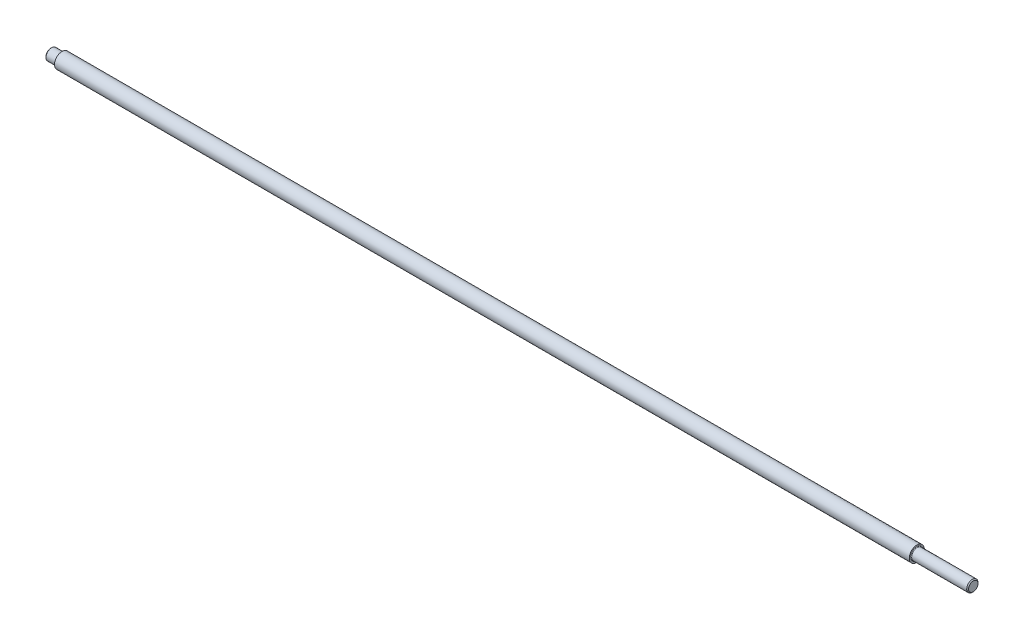
ISO-10303-21;
HEADER;
FILE_DESCRIPTION(('STEP AP214'),'2;1');
FILE_NAME('part.step','',(''),(''),'','','');
FILE_SCHEMA(('AUTOMOTIVE_DESIGN { 1 0 10303 214 1 1 1 1 }'));
ENDSEC;
DATA;
#1=APPLICATION_CONTEXT('core data for automotive mechanical design processes');
#2=APPLICATION_PROTOCOL_DEFINITION('international standard','automotive_design',2000,#1);
#3=PRODUCT_CONTEXT('',#1,'mechanical');
#4=PRODUCT('Part','Part','',(#3));
#5=PRODUCT_RELATED_PRODUCT_CATEGORY('part','',(#4));
#6=PRODUCT_DEFINITION_FORMATION('','',#4);
#7=PRODUCT_DEFINITION_CONTEXT('part definition',#1,'design');
#8=PRODUCT_DEFINITION('design','',#6,#7);
#9=PRODUCT_DEFINITION_SHAPE('','',#8);
#10=(LENGTH_UNIT() NAMED_UNIT(*) SI_UNIT(.MILLI.,.METRE.));
#11=(NAMED_UNIT(*) PLANE_ANGLE_UNIT() SI_UNIT($,.RADIAN.));
#12=(NAMED_UNIT(*) SI_UNIT($,.STERADIAN.) SOLID_ANGLE_UNIT());
#13=UNCERTAINTY_MEASURE_WITH_UNIT(LENGTH_MEASURE(1.E-05),#10,'distance_accuracy_value','');
#14=(GEOMETRIC_REPRESENTATION_CONTEXT(3) GLOBAL_UNCERTAINTY_ASSIGNED_CONTEXT((#13)) GLOBAL_UNIT_ASSIGNED_CONTEXT((#10,
#11,#12)) REPRESENTATION_CONTEXT('',''));
#15=CARTESIAN_POINT('',(0.,0.,0.));
#16=DIRECTION('',(0.,0.,1.));
#17=DIRECTION('',(1.,0.,0.));
#18=AXIS2_PLACEMENT_3D('',#15,#16,#17);
#19=CARTESIAN_POINT('',(0.5,0.,0.));
#20=DIRECTION('',(1.,0.,0.));
#21=DIRECTION('',(0.,0.,-1.));
#22=AXIS2_PLACEMENT_3D('',#19,#20,#21);
#23=CONICAL_SURFACE('',#22,3.,0.785398163397448);
#24=CARTESIAN_POINT('',(0.,0.,0.));
#25=DIRECTION('',(1.,0.,0.));
#26=DIRECTION('',(0.,0.,-1.));
#27=AXIS2_PLACEMENT_3D('',#24,#25,#26);
#28=CIRCLE('',#27,2.5);
#29=CARTESIAN_POINT('',(0.,0.,-2.5));
#30=VERTEX_POINT('',#29);
#31=EDGE_CURVE('E80',#30,#30,#28,.T.);
#32=ORIENTED_EDGE('',*,*,#31,.T.);
#33=EDGE_LOOP('',(#32));
#34=FACE_BOUND('',#33,.T.);
#35=CARTESIAN_POINT('',(0.5,0.,0.));
#36=DIRECTION('',(1.,0.,0.));
#37=DIRECTION('',(0.,0.,-1.));
#38=AXIS2_PLACEMENT_3D('',#35,#36,#37);
#39=CIRCLE('',#38,3.);
#40=CARTESIAN_POINT('',(0.5,0.,-3.));
#41=VERTEX_POINT('',#40);
#42=EDGE_CURVE('E12',#41,#41,#39,.T.);
#43=ORIENTED_EDGE('',*,*,#42,.F.);
#44=EDGE_LOOP('',(#43));
#45=FACE_BOUND('',#44,.T.);
#46=ADVANCED_FACE('F46',(#34,#45),#23,.T.);
#47=CARTESIAN_POINT('',(0.,0.,0.));
#48=DIRECTION('',(1.,0.,0.));
#49=DIRECTION('',(0.,0.,-1.));
#50=AXIS2_PLACEMENT_3D('',#47,#48,#49);
#51=CYLINDRICAL_SURFACE('',#50,3.);
#52=ORIENTED_EDGE('',*,*,#42,.T.);
#53=EDGE_LOOP('',(#52));
#54=FACE_BOUND('',#53,.T.);
#55=CARTESIAN_POINT('',(5.7,0.,0.));
#56=DIRECTION('',(1.,0.,0.));
#57=DIRECTION('',(0.,0.,-1.));
#58=AXIS2_PLACEMENT_3D('',#55,#56,#57);
#59=CIRCLE('',#58,3.);
#60=CARTESIAN_POINT('',(5.7,0.,-3.));
#61=VERTEX_POINT('',#60);
#62=EDGE_CURVE('E52',#61,#61,#59,.T.);
#63=ORIENTED_EDGE('',*,*,#62,.F.);
#64=EDGE_LOOP('',(#63));
#65=FACE_BOUND('',#64,.T.);
#66=ADVANCED_FACE('F97',(#54,#65),#51,.T.);
#67=CARTESIAN_POINT('',(5.70000000000012,0.,0.));
#68=DIRECTION('',(1.,0.,0.));
#69=DIRECTION('',(0.,0.,-1.));
#70=AXIS2_PLACEMENT_3D('',#67,#68,#69);
#71=TOROIDAL_SURFACE('',#70,3.29999999999988,0.299999999999877);
#72=ORIENTED_EDGE('',*,*,#62,.T.);
#73=EDGE_LOOP('',(#72));
#74=FACE_BOUND('',#73,.T.);
#75=CARTESIAN_POINT('',(6.,0.,0.));
#76=DIRECTION('',(1.,0.,0.));
#77=DIRECTION('',(0.,0.,-1.));
#78=AXIS2_PLACEMENT_3D('',#75,#76,#77);
#79=CIRCLE('',#78,3.29999999999988);
#80=CARTESIAN_POINT('',(6.,0.,-3.29999999999988));
#81=VERTEX_POINT('',#80);
#82=EDGE_CURVE('E56',#81,#81,#79,.T.);
#83=ORIENTED_EDGE('',*,*,#82,.F.);
#84=EDGE_LOOP('',(#83));
#85=FACE_BOUND('',#84,.T.);
#86=ADVANCED_FACE('F101',(#74,#85),#71,.F.);
#87=CARTESIAN_POINT('',(6.,4.,0.));
#88=DIRECTION('',(-1.,0.,0.));
#89=DIRECTION('',(0.,0.,1.));
#90=AXIS2_PLACEMENT_3D('',#87,#88,#89);
#91=PLANE('',#90);
#92=ORIENTED_EDGE('',*,*,#82,.T.);
#93=EDGE_LOOP('',(#92));
#94=FACE_BOUND('',#93,.T.);
#95=CARTESIAN_POINT('',(6.,0.,0.));
#96=DIRECTION('',(1.,0.,0.));
#97=DIRECTION('',(0.,0.,-1.));
#98=AXIS2_PLACEMENT_3D('',#95,#96,#97);
#99=CIRCLE('',#98,4.);
#100=CARTESIAN_POINT('',(6.,0.,-4.));
#101=VERTEX_POINT('',#100);
#102=EDGE_CURVE('E60',#101,#101,#99,.T.);
#103=ORIENTED_EDGE('',*,*,#102,.F.);
#104=EDGE_LOOP('',(#103));
#105=FACE_BOUND('',#104,.T.);
#106=ADVANCED_FACE('F105',(#94,#105),#91,.T.);
#107=CARTESIAN_POINT('',(0.,0.,0.));
#108=DIRECTION('',(1.,0.,0.));
#109=DIRECTION('',(0.,0.,-1.));
#110=AXIS2_PLACEMENT_3D('',#107,#108,#109);
#111=CYLINDRICAL_SURFACE('',#110,4.);
#112=ORIENTED_EDGE('',*,*,#102,.T.);
#113=EDGE_LOOP('',(#112));
#114=FACE_BOUND('',#113,.T.);
#115=CARTESIAN_POINT('',(460.,0.,0.));
#116=DIRECTION('',(1.,0.,0.));
#117=DIRECTION('',(0.,0.,-1.));
#118=AXIS2_PLACEMENT_3D('',#115,#116,#117);
#119=CIRCLE('',#118,4.);
#120=CARTESIAN_POINT('',(460.,0.,-4.));
#121=VERTEX_POINT('',#120);
#122=EDGE_CURVE('E65',#121,#121,#119,.T.);
#123=ORIENTED_EDGE('',*,*,#122,.F.);
#124=EDGE_LOOP('',(#123));
#125=FACE_BOUND('',#124,.T.);
#126=ADVANCED_FACE('F111',(#114,#125),#111,.T.);
#127=CARTESIAN_POINT('',(460.,3.29999999999311,0.));
#128=DIRECTION('',(1.,0.,0.));
#129=DIRECTION('',(0.,0.,-1.));
#130=AXIS2_PLACEMENT_3D('',#127,#128,#129);
#131=PLANE('',#130);
#132=ORIENTED_EDGE('',*,*,#122,.T.);
#133=EDGE_LOOP('',(#132));
#134=FACE_BOUND('',#133,.T.);
#135=CARTESIAN_POINT('',(460.,0.,0.));
#136=DIRECTION('',(1.,0.,0.));
#137=DIRECTION('',(0.,0.,-1.));
#138=AXIS2_PLACEMENT_3D('',#135,#136,#137);
#139=CIRCLE('',#138,3.29999999999311);
#140=CARTESIAN_POINT('',(460.,0.,-3.29999999999311));
#141=VERTEX_POINT('',#140);
#142=EDGE_CURVE('E68',#141,#141,#139,.T.);
#143=ORIENTED_EDGE('',*,*,#142,.F.);
#144=EDGE_LOOP('',(#143));
#145=FACE_BOUND('',#144,.T.);
#146=ADVANCED_FACE('F115',(#134,#145),#131,.T.);
#147=CARTESIAN_POINT('',(460.299999999993,0.,0.));
#148=DIRECTION('',(1.,0.,0.));
#149=DIRECTION('',(0.,0.,-1.));
#150=AXIS2_PLACEMENT_3D('',#147,#148,#149);
#151=TOROIDAL_SURFACE('',#150,3.29999999999311,0.299999999993041);
#152=ORIENTED_EDGE('',*,*,#142,.T.);
#153=EDGE_LOOP('',(#152));
#154=FACE_BOUND('',#153,.T.);
#155=CARTESIAN_POINT('',(460.299999999993,0.,0.));
#156=DIRECTION('',(1.,0.,0.));
#157=DIRECTION('',(0.,0.,-1.));
#158=AXIS2_PLACEMENT_3D('',#155,#156,#157);
#159=CIRCLE('',#158,3.00000000000006);
#160=CARTESIAN_POINT('',(460.299999999993,0.,-3.00000000000006));
#161=VERTEX_POINT('',#160);
#162=EDGE_CURVE('E71',#161,#161,#159,.T.);
#163=ORIENTED_EDGE('',*,*,#162,.F.);
#164=EDGE_LOOP('',(#163));
#165=FACE_BOUND('',#164,.T.);
#166=ADVANCED_FACE('F119',(#154,#165),#151,.F.);
#167=CARTESIAN_POINT('',(0.,0.,0.));
#168=DIRECTION('',(1.,0.,0.));
#169=DIRECTION('',(0.,0.,-1.));
#170=AXIS2_PLACEMENT_3D('',#167,#168,#169);
#171=CYLINDRICAL_SURFACE('',#170,3.00000000000008);
#172=ORIENTED_EDGE('',*,*,#162,.T.);
#173=EDGE_LOOP('',(#172));
#174=FACE_BOUND('',#173,.T.);
#175=CARTESIAN_POINT('',(489.5,0.,0.));
#176=DIRECTION('',(1.,0.,0.));
#177=DIRECTION('',(0.,0.,-1.));
#178=AXIS2_PLACEMENT_3D('',#175,#176,#177);
#179=CIRCLE('',#178,3.0000000000001);
#180=CARTESIAN_POINT('',(489.5,0.,-3.0000000000001));
#181=VERTEX_POINT('',#180);
#182=EDGE_CURVE('E74',#181,#181,#179,.T.);
#183=ORIENTED_EDGE('',*,*,#182,.F.);
#184=EDGE_LOOP('',(#183));
#185=FACE_BOUND('',#184,.T.);
#186=ADVANCED_FACE('F123',(#174,#185),#171,.T.);
#187=CARTESIAN_POINT('',(490.,0.,0.));
#188=DIRECTION('',(-1.,0.,0.));
#189=DIRECTION('',(0.,0.,1.));
#190=AXIS2_PLACEMENT_3D('',#187,#188,#189);
#191=CONICAL_SURFACE('',#190,2.5000000000001,0.785398163397448);
#192=ORIENTED_EDGE('',*,*,#182,.T.);
#193=EDGE_LOOP('',(#192));
#194=FACE_BOUND('',#193,.T.);
#195=CARTESIAN_POINT('',(490.,0.,0.));
#196=DIRECTION('',(1.,0.,0.));
#197=DIRECTION('',(0.,0.,-1.));
#198=AXIS2_PLACEMENT_3D('',#195,#196,#197);
#199=CIRCLE('',#198,2.5000000000001);
#200=CARTESIAN_POINT('',(490.,0.,-2.5000000000001));
#201=VERTEX_POINT('',#200);
#202=EDGE_CURVE('E77',#201,#201,#199,.T.);
#203=ORIENTED_EDGE('',*,*,#202,.F.);
#204=EDGE_LOOP('',(#203));
#205=FACE_BOUND('',#204,.T.);
#206=ADVANCED_FACE('F93',(#194,#205),#191,.T.);
#207=CARTESIAN_POINT('',(490.,0.,0.));
#208=DIRECTION('',(1.,0.,0.));
#209=DIRECTION('',(0.,0.,-1.));
#210=AXIS2_PLACEMENT_3D('',#207,#208,#209);
#211=PLANE('',#210);
#212=ORIENTED_EDGE('',*,*,#202,.T.);
#213=EDGE_LOOP('',(#212));
#214=FACE_BOUND('',#213,.T.);
#215=ADVANCED_FACE('F88',(#214),#211,.T.);
#216=CARTESIAN_POINT('',(0.,2.5,0.));
#217=DIRECTION('',(-1.,0.,0.));
#218=DIRECTION('',(0.,0.,1.));
#219=AXIS2_PLACEMENT_3D('',#216,#217,#218);
#220=PLANE('',#219);
#221=ORIENTED_EDGE('',*,*,#31,.F.);
#222=EDGE_LOOP('',(#221));
#223=FACE_BOUND('',#222,.T.);
#224=ADVANCED_FACE('F86',(#223),#220,.T.);
#225=CLOSED_SHELL('',(#46,#66,#86,#106,#126,#146,#166,#186,#206,#215,#224));
#226=MANIFOLD_SOLID_BREP('B2',#225);
#227=ADVANCED_BREP_SHAPE_REPRESENTATION('',(#18,#226),#14);
#228=SHAPE_DEFINITION_REPRESENTATION(#9,#227);
ENDSEC;
END-ISO-10303-21;
